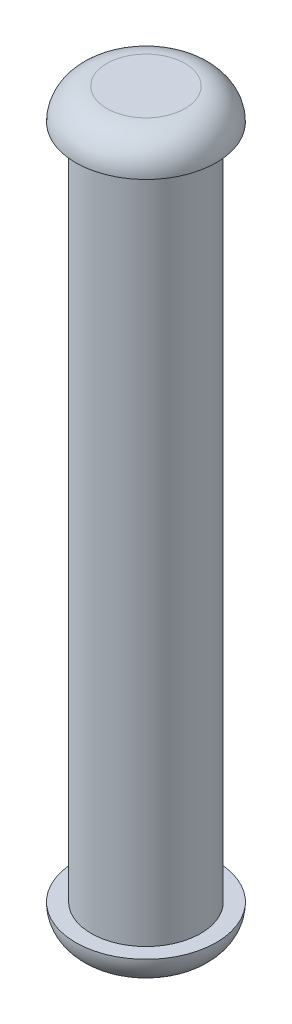
ISO-10303-21;
HEADER;
FILE_DESCRIPTION(('STEP AP214'),'2;1');
FILE_NAME('part.step','',(''),(''),'','','');
FILE_SCHEMA(('AUTOMOTIVE_DESIGN { 1 0 10303 214 1 1 1 1 }'));
ENDSEC;
DATA;
#1=APPLICATION_CONTEXT('core data for automotive mechanical design processes');
#2=APPLICATION_PROTOCOL_DEFINITION('international standard','automotive_design',2000,#1);
#3=PRODUCT_CONTEXT('',#1,'mechanical');
#4=PRODUCT('Part','Part','',(#3));
#5=PRODUCT_RELATED_PRODUCT_CATEGORY('part','',(#4));
#6=PRODUCT_DEFINITION_FORMATION('','',#4);
#7=PRODUCT_DEFINITION_CONTEXT('part definition',#1,'design');
#8=PRODUCT_DEFINITION('design','',#6,#7);
#9=PRODUCT_DEFINITION_SHAPE('','',#8);
#10=(LENGTH_UNIT() NAMED_UNIT(*) SI_UNIT(.MILLI.,.METRE.));
#11=(NAMED_UNIT(*) PLANE_ANGLE_UNIT() SI_UNIT($,.RADIAN.));
#12=(NAMED_UNIT(*) SI_UNIT($,.STERADIAN.) SOLID_ANGLE_UNIT());
#13=UNCERTAINTY_MEASURE_WITH_UNIT(LENGTH_MEASURE(1.E-05),#10,'distance_accuracy_value','');
#14=(GEOMETRIC_REPRESENTATION_CONTEXT(3) GLOBAL_UNCERTAINTY_ASSIGNED_CONTEXT((#13)) GLOBAL_UNIT_ASSIGNED_CONTEXT((#10,
#11,#12)) REPRESENTATION_CONTEXT('',''));
#15=CARTESIAN_POINT('',(0.,0.,0.));
#16=DIRECTION('',(0.,0.,1.));
#17=DIRECTION('',(1.,0.,0.));
#18=AXIS2_PLACEMENT_3D('',#15,#16,#17);
#19=CARTESIAN_POINT('',(0.,10.8,0.));
#20=DIRECTION('',(0.,-1.,0.));
#21=DIRECTION('',(0.,0.,-1.));
#22=AXIS2_PLACEMENT_3D('',#19,#20,#21);
#23=CYLINDRICAL_SURFACE('',#22,1.75);
#24=CARTESIAN_POINT('',(0.,10.8,0.));
#25=DIRECTION('',(0.,1.,0.));
#26=DIRECTION('',(0.,0.,1.));
#27=AXIS2_PLACEMENT_3D('',#24,#25,#26);
#28=CIRCLE('',#27,1.75);
#29=CARTESIAN_POINT('',(0.,10.8,-1.75));
#30=VERTEX_POINT('',#29);
#31=EDGE_CURVE('E50',#30,#30,#28,.T.);
#32=CARTESIAN_POINT('',(0.,-10.8,0.));
#33=DIRECTION('',(0.,1.,0.));
#34=DIRECTION('',(0.,0.,1.));
#35=AXIS2_PLACEMENT_3D('',#32,#33,#34);
#36=CIRCLE('',#35,1.75);
#37=CARTESIAN_POINT('',(0.,-10.8,-1.75));
#38=VERTEX_POINT('',#37);
#39=EDGE_CURVE('E57',#38,#38,#36,.T.);
#40=CARTESIAN_POINT('',(0.,10.8,-1.75));
#41=CARTESIAN_POINT('',(0.,10.575,-1.75));
#42=CARTESIAN_POINT('',(0.,10.35,-1.75));
#43=CARTESIAN_POINT('',(0.,9.9,-1.75));
#44=CARTESIAN_POINT('',(0.,9.675,-1.75));
#45=CARTESIAN_POINT('',(0.,9.225,-1.75));
#46=CARTESIAN_POINT('',(0.,9.,-1.75));
#47=CARTESIAN_POINT('',(0.,8.55,-1.75));
#48=CARTESIAN_POINT('',(0.,8.325,-1.75));
#49=CARTESIAN_POINT('',(0.,7.875,-1.75));
#50=CARTESIAN_POINT('',(0.,7.65,-1.75));
#51=CARTESIAN_POINT('',(0.,7.2,-1.75));
#52=CARTESIAN_POINT('',(0.,6.975,-1.75));
#53=CARTESIAN_POINT('',(0.,6.525,-1.75));
#54=CARTESIAN_POINT('',(0.,6.3,-1.75));
#55=CARTESIAN_POINT('',(0.,5.85,-1.75));
#56=CARTESIAN_POINT('',(0.,5.625,-1.75));
#57=CARTESIAN_POINT('',(0.,5.175,-1.75));
#58=CARTESIAN_POINT('',(0.,4.95,-1.75));
#59=CARTESIAN_POINT('',(0.,4.5,-1.75));
#60=CARTESIAN_POINT('',(0.,4.275,-1.75));
#61=CARTESIAN_POINT('',(0.,3.825,-1.75));
#62=CARTESIAN_POINT('',(0.,3.6,-1.75));
#63=CARTESIAN_POINT('',(0.,3.15,-1.75));
#64=CARTESIAN_POINT('',(0.,2.925,-1.75));
#65=CARTESIAN_POINT('',(0.,2.475,-1.75));
#66=CARTESIAN_POINT('',(0.,2.25,-1.75));
#67=CARTESIAN_POINT('',(0.,1.8,-1.75));
#68=CARTESIAN_POINT('',(0.,1.575,-1.75));
#69=CARTESIAN_POINT('',(0.,1.125,-1.75));
#70=CARTESIAN_POINT('',(0.,0.899999999999997,-1.75));
#71=CARTESIAN_POINT('',(0.,0.449999999999997,-1.75));
#72=CARTESIAN_POINT('',(0.,0.224999999999997,-1.75));
#73=CARTESIAN_POINT('',(0.,-0.225000000000004,-1.75));
#74=CARTESIAN_POINT('',(0.,-0.450000000000004,-1.75));
#75=CARTESIAN_POINT('',(0.,-0.900000000000004,-1.75));
#76=CARTESIAN_POINT('',(0.,-1.125,-1.75));
#77=CARTESIAN_POINT('',(0.,-1.575,-1.75));
#78=CARTESIAN_POINT('',(0.,-1.8,-1.75));
#79=CARTESIAN_POINT('',(0.,-2.25,-1.75));
#80=CARTESIAN_POINT('',(0.,-2.475,-1.75));
#81=CARTESIAN_POINT('',(0.,-2.925,-1.75));
#82=CARTESIAN_POINT('',(0.,-3.15,-1.75));
#83=CARTESIAN_POINT('',(0.,-3.6,-1.75));
#84=CARTESIAN_POINT('',(0.,-3.82500000000001,-1.75));
#85=CARTESIAN_POINT('',(0.,-4.27500000000001,-1.75));
#86=CARTESIAN_POINT('',(0.,-4.5,-1.75));
#87=CARTESIAN_POINT('',(0.,-4.95,-1.75));
#88=CARTESIAN_POINT('',(0.,-5.175,-1.75));
#89=CARTESIAN_POINT('',(0.,-5.625,-1.75));
#90=CARTESIAN_POINT('',(0.,-5.85,-1.75));
#91=CARTESIAN_POINT('',(0.,-6.3,-1.75));
#92=CARTESIAN_POINT('',(0.,-6.525,-1.75));
#93=CARTESIAN_POINT('',(0.,-6.975,-1.75));
#94=CARTESIAN_POINT('',(0.,-7.2,-1.75));
#95=CARTESIAN_POINT('',(0.,-7.65,-1.75));
#96=CARTESIAN_POINT('',(0.,-7.875,-1.75));
#97=CARTESIAN_POINT('',(0.,-8.325,-1.75));
#98=CARTESIAN_POINT('',(0.,-8.55,-1.75));
#99=CARTESIAN_POINT('',(0.,-9.00000000000001,-1.75));
#100=CARTESIAN_POINT('',(0.,-9.225,-1.75));
#101=CARTESIAN_POINT('',(0.,-9.675,-1.75));
#102=CARTESIAN_POINT('',(0.,-9.9,-1.75));
#103=CARTESIAN_POINT('',(0.,-10.35,-1.75));
#104=CARTESIAN_POINT('',(0.,-10.575,-1.75));
#105=CARTESIAN_POINT('',(0.,-10.8,-1.75));
#106=B_SPLINE_CURVE_WITH_KNOTS('',3,(#40,#41,#42,#43,#44,#45,#46,#47,#48,#49,#50,#51,#52,#53,
#54,#55,#56,#57,#58,#59,#60,#61,#62,#63,#64,#65,#66,#67,#68,#69,#70,#71,#72,#73,#74,#75,#76,#77,
#78,#79,#80,#81,#82,#83,#84,#85,#86,#87,#88,#89,#90,#91,#92,#93,#94,#95,#96,#97,#98,#99,#100,
#101,#102,#103,#104,#105),.UNSPECIFIED.,.F.,.F.,(4,2,2,2,2,2,2,2,2,2,2,2,2,2,2,2,2,2,2,2,2,2,2,
2,2,2,2,2,2,2,2,2,4),(0.,0.674999999999998,1.35,2.025,2.7,3.375,4.05,4.725,5.4,6.075,6.75,7.425,
8.1,8.775,9.45,10.125,10.8,11.475,12.15,12.825,13.5,14.175,14.85,15.525,16.2,16.875,17.55,
18.225,18.9,19.575,20.25,20.925,21.6),.UNSPECIFIED.);
#107=EDGE_CURVE('BSEAM39',#30,#38,#106,.T.);
#108=ORIENTED_EDGE('',*,*,#31,.F.);
#109=ORIENTED_EDGE('',*,*,#39,.T.);
#110=ORIENTED_EDGE('',*,*,#107,.T.);
#111=ORIENTED_EDGE('',*,*,#107,.F.);
#112=EDGE_LOOP('',(#108,#110,#109,#111));
#113=FACE_BOUND('',#112,.T.);
#114=ADVANCED_FACE('F39',(#113),#23,.T.);
#115=CARTESIAN_POINT('',(0.,11.8,0.));
#116=DIRECTION('',(0.,1.,0.));
#117=DIRECTION('',(0.,0.,1.));
#118=AXIS2_PLACEMENT_3D('',#115,#116,#117);
#119=PLANE('',#118);
#120=CARTESIAN_POINT('',(0.,11.8,0.));
#121=DIRECTION('',(0.,1.,0.));
#122=DIRECTION('',(0.,0.,1.));
#123=AXIS2_PLACEMENT_3D('',#120,#121,#122);
#124=CIRCLE('',#123,1.25);
#125=CARTESIAN_POINT('',(0.,11.8,1.25));
#126=VERTEX_POINT('',#125);
#127=EDGE_CURVE('E10',#126,#126,#124,.T.);
#128=ORIENTED_EDGE('',*,*,#127,.T.);
#129=EDGE_LOOP('',(#128));
#130=FACE_BOUND('',#129,.T.);
#131=ADVANCED_FACE('F82',(#130),#119,.T.);
#132=CARTESIAN_POINT('',(0.,10.8,0.));
#133=DIRECTION('',(0.,1.,0.));
#134=DIRECTION('',(0.,0.,1.));
#135=AXIS2_PLACEMENT_3D('',#132,#133,#134);
#136=PLANE('',#135);
#137=ORIENTED_EDGE('',*,*,#31,.T.);
#138=EDGE_LOOP('',(#137));
#139=FACE_BOUND('',#138,.T.);
#140=CARTESIAN_POINT('',(0.,10.8,0.));
#141=DIRECTION('',(0.,1.,0.));
#142=DIRECTION('',(0.,0.,1.));
#143=AXIS2_PLACEMENT_3D('',#140,#141,#142);
#144=CIRCLE('',#143,2.25);
#145=CARTESIAN_POINT('',(0.,10.8,2.25));
#146=VERTEX_POINT('',#145);
#147=EDGE_CURVE('E54',#146,#146,#144,.T.);
#148=ORIENTED_EDGE('',*,*,#147,.F.);
#149=EDGE_LOOP('',(#148));
#150=FACE_BOUND('',#149,.T.);
#151=ADVANCED_FACE('F88',(#139,#150),#136,.F.);
#152=CARTESIAN_POINT('',(0.,-11.8,0.));
#153=DIRECTION('',(0.,-1.,0.));
#154=DIRECTION('',(0.,0.,1.));
#155=AXIS2_PLACEMENT_3D('',#152,#153,#154);
#156=PLANE('',#155);
#157=CARTESIAN_POINT('',(0.,-11.8,0.));
#158=DIRECTION('',(0.,-1.,0.));
#159=DIRECTION('',(0.,0.,-1.));
#160=AXIS2_PLACEMENT_3D('',#157,#158,#159);
#161=CIRCLE('',#160,1.25);
#162=CARTESIAN_POINT('',(0.,-11.8,-1.25));
#163=VERTEX_POINT('',#162);
#164=EDGE_CURVE('E46',#163,#163,#161,.T.);
#165=ORIENTED_EDGE('',*,*,#164,.T.);
#166=EDGE_LOOP('',(#165));
#167=FACE_BOUND('',#166,.T.);
#168=ADVANCED_FACE('F77',(#167),#156,.T.);
#169=CARTESIAN_POINT('',(0.,-10.8,0.));
#170=DIRECTION('',(0.,-1.,0.));
#171=DIRECTION('',(0.,0.,1.));
#172=AXIS2_PLACEMENT_3D('',#169,#170,#171);
#173=PLANE('',#172);
#174=ORIENTED_EDGE('',*,*,#39,.F.);
#175=EDGE_LOOP('',(#174));
#176=FACE_BOUND('',#175,.T.);
#177=CARTESIAN_POINT('',(0.,-10.8,0.));
#178=DIRECTION('',(0.,1.,0.));
#179=DIRECTION('',(0.,0.,1.));
#180=AXIS2_PLACEMENT_3D('',#177,#178,#179);
#181=CIRCLE('',#180,2.25);
#182=CARTESIAN_POINT('',(0.,-10.8,2.25));
#183=VERTEX_POINT('',#182);
#184=EDGE_CURVE('E59',#183,#183,#181,.T.);
#185=ORIENTED_EDGE('',*,*,#184,.T.);
#186=EDGE_LOOP('',(#185));
#187=FACE_BOUND('',#186,.T.);
#188=ADVANCED_FACE('F66',(#176,#187),#173,.F.);
#189=CARTESIAN_POINT('',(0.,-10.8,0.));
#190=DIRECTION('',(0.,-1.,0.));
#191=DIRECTION('',(0.,0.,-1.));
#192=AXIS2_PLACEMENT_3D('',#189,#190,#191);
#193=TOROIDAL_SURFACE('',#192,1.25,1.);
#194=ORIENTED_EDGE('',*,*,#164,.F.);
#195=EDGE_LOOP('',(#194));
#196=FACE_BOUND('',#195,.T.);
#197=ORIENTED_EDGE('',*,*,#184,.F.);
#198=EDGE_LOOP('',(#197));
#199=FACE_BOUND('',#198,.T.);
#200=ADVANCED_FACE('F68',(#196,#199),#193,.T.);
#201=CARTESIAN_POINT('',(0.,10.8,0.));
#202=DIRECTION('',(0.,1.,0.));
#203=DIRECTION('',(0.,0.,1.));
#204=AXIS2_PLACEMENT_3D('',#201,#202,#203);
#205=TOROIDAL_SURFACE('',#204,1.25,1.);
#206=ORIENTED_EDGE('',*,*,#147,.T.);
#207=EDGE_LOOP('',(#206));
#208=FACE_BOUND('',#207,.T.);
#209=ORIENTED_EDGE('',*,*,#127,.F.);
#210=EDGE_LOOP('',(#209));
#211=FACE_BOUND('',#210,.T.);
#212=ADVANCED_FACE('F41',(#208,#211),#205,.T.);
#213=CLOSED_SHELL('',(#114,#131,#151,#168,#188,#200,#212));
#214=MANIFOLD_SOLID_BREP('B2',#213);
#215=ADVANCED_BREP_SHAPE_REPRESENTATION('',(#18,#214),#14);
#216=SHAPE_DEFINITION_REPRESENTATION(#9,#215);
ENDSEC;
END-ISO-10303-21;
